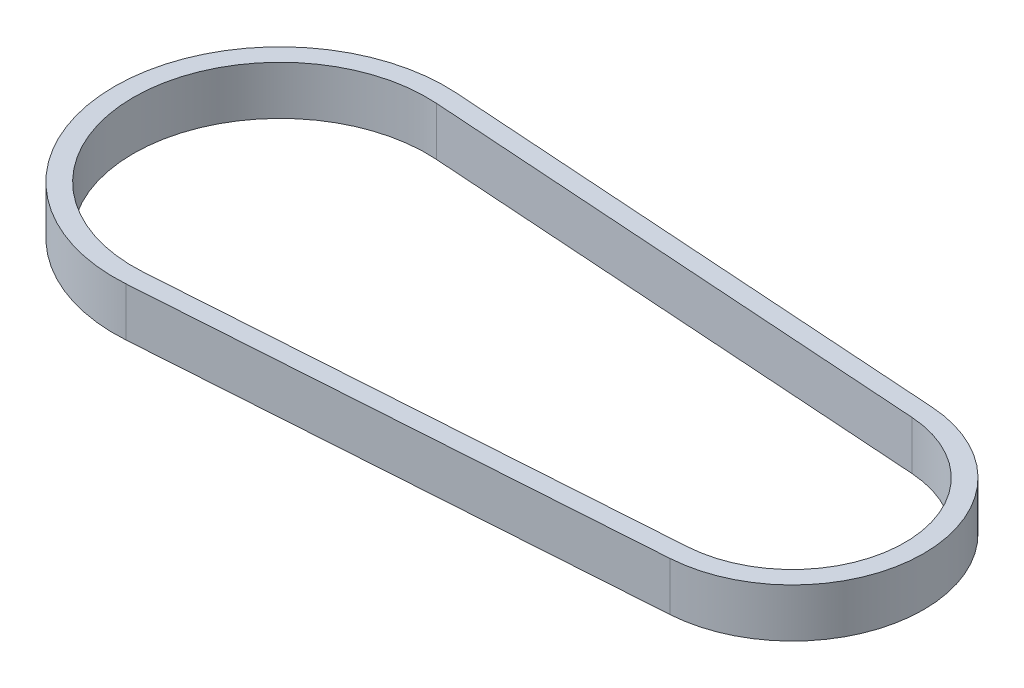
ISO-10303-21;
HEADER;
FILE_DESCRIPTION(('STEP AP214'),'2;1');
FILE_NAME('part.step','',(''),(''),'','','');
FILE_SCHEMA(('AUTOMOTIVE_DESIGN { 1 0 10303 214 1 1 1 1 }'));
ENDSEC;
DATA;
#1=APPLICATION_CONTEXT('core data for automotive mechanical design processes');
#2=APPLICATION_PROTOCOL_DEFINITION('international standard','automotive_design',2000,#1);
#3=PRODUCT_CONTEXT('',#1,'mechanical');
#4=PRODUCT('Part','Part','',(#3));
#5=PRODUCT_RELATED_PRODUCT_CATEGORY('part','',(#4));
#6=PRODUCT_DEFINITION_FORMATION('','',#4);
#7=PRODUCT_DEFINITION_CONTEXT('part definition',#1,'design');
#8=PRODUCT_DEFINITION('design','',#6,#7);
#9=PRODUCT_DEFINITION_SHAPE('','',#8);
#10=(LENGTH_UNIT() NAMED_UNIT(*) SI_UNIT(.MILLI.,.METRE.));
#11=(NAMED_UNIT(*) PLANE_ANGLE_UNIT() SI_UNIT($,.RADIAN.));
#12=(NAMED_UNIT(*) SI_UNIT($,.STERADIAN.) SOLID_ANGLE_UNIT());
#13=UNCERTAINTY_MEASURE_WITH_UNIT(LENGTH_MEASURE(1.E-05),#10,'distance_accuracy_value','');
#14=(GEOMETRIC_REPRESENTATION_CONTEXT(3) GLOBAL_UNCERTAINTY_ASSIGNED_CONTEXT((#13)) GLOBAL_UNIT_ASSIGNED_CONTEXT((#10,
#11,#12)) REPRESENTATION_CONTEXT('',''));
#15=CARTESIAN_POINT('',(0.,0.,0.));
#16=DIRECTION('',(0.,0.,1.));
#17=DIRECTION('',(1.,0.,0.));
#18=AXIS2_PLACEMENT_3D('',#15,#16,#17);
#19=CARTESIAN_POINT('',(2.05303270042194,9.,-30.5811634299776));
#20=DIRECTION('',(0.0669831223628692,0.,-0.997754108645272));
#21=DIRECTION('',(-0.997754108645272,0.,-0.0669831223628692));
#22=AXIS2_PLACEMENT_3D('',#19,#20,#21);
#23=PLANE('',#22);
#24=DIRECTION('',(0.997754108645272,0.,0.0669831223628692));
#25=VECTOR('',#24,1.);
#26=CARTESIAN_POINT('',(2.05303270042194,0.,-30.5811634299776));
#27=LINE('',#26,#25);
#28=CARTESIAN_POINT('',(2.05303270042194,0.,-30.5811634299776));
#29=VERTEX_POINT('',#28);
#30=CARTESIAN_POINT('',(96.4276898734177,0.,-24.2454248400801));
#31=VERTEX_POINT('',#30);
#32=EDGE_CURVE('E155',#29,#31,#27,.T.);
#33=ORIENTED_EDGE('',*,*,#32,.F.);
#34=DIRECTION('',(0.,-1.,0.));
#35=VECTOR('',#34,1.);
#36=CARTESIAN_POINT('',(2.05303270042194,9.,-30.5811634299776));
#37=LINE('',#36,#35);
#38=CARTESIAN_POINT('',(2.05303270042194,9.,-30.5811634299776));
#39=VERTEX_POINT('',#38);
#40=EDGE_CURVE('E11',#39,#29,#37,.T.);
#41=ORIENTED_EDGE('',*,*,#40,.F.);
#42=DIRECTION('',(0.997754108645272,0.,0.0669831223628692));
#43=VECTOR('',#42,1.);
#44=CARTESIAN_POINT('',(2.05303270042194,9.,-30.5811634299776));
#45=LINE('',#44,#43);
#46=CARTESIAN_POINT('',(96.4276898734177,9.,-24.2454248400801));
#47=VERTEX_POINT('',#46);
#48=EDGE_CURVE('E128',#39,#47,#45,.T.);
#49=ORIENTED_EDGE('',*,*,#48,.T.);
#50=DIRECTION('',(0.,-1.,0.));
#51=VECTOR('',#50,1.);
#52=CARTESIAN_POINT('',(96.4276898734177,9.,-24.2454248400801));
#53=LINE('',#52,#51);
#54=EDGE_CURVE('E94',#47,#31,#53,.T.);
#55=ORIENTED_EDGE('',*,*,#54,.T.);
#56=EDGE_LOOP('',(#33,#41,#49,#55));
#57=FACE_BOUND('',#56,.T.);
#58=ADVANCED_FACE('F41',(#57),#23,.T.);
#59=CARTESIAN_POINT('',(0.,9.,0.));
#60=DIRECTION('',(0.,-1.,0.));
#61=DIRECTION('',(0.,0.,-1.));
#62=AXIS2_PLACEMENT_3D('',#59,#60,#61);
#63=CYLINDRICAL_SURFACE('',#62,30.65);
#64=CARTESIAN_POINT('',(0.,0.,0.));
#65=DIRECTION('',(0.,1.,0.));
#66=DIRECTION('',(0.,0.,1.));
#67=AXIS2_PLACEMENT_3D('',#64,#65,#66);
#68=CIRCLE('',#67,30.65);
#69=CARTESIAN_POINT('',(2.05303270042194,0.,30.5811634299776));
#70=VERTEX_POINT('',#69);
#71=EDGE_CURVE('E133',#29,#70,#68,.T.);
#72=ORIENTED_EDGE('',*,*,#71,.T.);
#73=DIRECTION('',(0.,-1.,0.));
#74=VECTOR('',#73,1.);
#75=CARTESIAN_POINT('',(2.05303270042194,9.,30.5811634299776));
#76=LINE('',#75,#74);
#77=CARTESIAN_POINT('',(2.05303270042194,9.,30.5811634299776));
#78=VERTEX_POINT('',#77);
#79=EDGE_CURVE('E51',#78,#70,#76,.T.);
#80=ORIENTED_EDGE('',*,*,#79,.F.);
#81=CARTESIAN_POINT('',(0.,9.,0.));
#82=DIRECTION('',(0.,1.,0.));
#83=DIRECTION('',(0.,0.,1.));
#84=AXIS2_PLACEMENT_3D('',#81,#82,#83);
#85=CIRCLE('',#84,30.65);
#86=EDGE_CURVE('E124',#39,#78,#85,.T.);
#87=ORIENTED_EDGE('',*,*,#86,.F.);
#88=ORIENTED_EDGE('',*,*,#40,.T.);
#89=EDGE_LOOP('',(#72,#80,#87,#88));
#90=FACE_BOUND('',#89,.T.);
#91=ADVANCED_FACE('F131',(#90),#63,.T.);
#92=CARTESIAN_POINT('',(2.05303270042194,9.,30.5811634299776));
#93=DIRECTION('',(-0.0669831223628691,0.,-0.997754108645272));
#94=DIRECTION('',(-0.997754108645272,0.,0.0669831223628691));
#95=AXIS2_PLACEMENT_3D('',#92,#93,#94);
#96=PLANE('',#95);
#97=DIRECTION('',(0.997754108645272,0.,-0.0669831223628691));
#98=VECTOR('',#97,1.);
#99=CARTESIAN_POINT('',(2.05303270042194,0.,30.5811634299776));
#100=LINE('',#99,#98);
#101=CARTESIAN_POINT('',(96.4276898734177,0.,24.2454248400801));
#102=VERTEX_POINT('',#101);
#103=EDGE_CURVE('E152',#70,#102,#100,.T.);
#104=ORIENTED_EDGE('',*,*,#103,.T.);
#105=DIRECTION('',(0.,-1.,0.));
#106=VECTOR('',#105,1.);
#107=CARTESIAN_POINT('',(96.4276898734177,9.,24.2454248400801));
#108=LINE('',#107,#106);
#109=CARTESIAN_POINT('',(96.4276898734177,9.,24.2454248400801));
#110=VERTEX_POINT('',#109);
#111=EDGE_CURVE('E123',#110,#102,#108,.T.);
#112=ORIENTED_EDGE('',*,*,#111,.F.);
#113=DIRECTION('',(0.997754108645272,0.,-0.0669831223628691));
#114=VECTOR('',#113,1.);
#115=CARTESIAN_POINT('',(2.05303270042194,9.,30.5811634299776));
#116=LINE('',#115,#114);
#117=EDGE_CURVE('E117',#78,#110,#116,.T.);
#118=ORIENTED_EDGE('',*,*,#117,.F.);
#119=ORIENTED_EDGE('',*,*,#79,.T.);
#120=EDGE_LOOP('',(#104,#112,#118,#119));
#121=FACE_BOUND('',#120,.T.);
#122=ADVANCED_FACE('F120',(#121),#96,.F.);
#123=CARTESIAN_POINT('',(0.,9.,0.));
#124=DIRECTION('',(0.,-1.,0.));
#125=DIRECTION('',(0.,0.,-1.));
#126=AXIS2_PLACEMENT_3D('',#123,#124,#125);
#127=CYLINDRICAL_SURFACE('',#126,27.15);
#128=CARTESIAN_POINT('',(0.,0.,0.));
#129=DIRECTION('',(0.,1.,0.));
#130=DIRECTION('',(0.,0.,1.));
#131=AXIS2_PLACEMENT_3D('',#128,#129,#130);
#132=CIRCLE('',#131,27.15);
#133=CARTESIAN_POINT('',(1.8185917721519,0.,-27.0890240497191));
#134=VERTEX_POINT('',#133);
#135=CARTESIAN_POINT('',(1.8185917721519,0.,27.0890240497191));
#136=VERTEX_POINT('',#135);
#137=EDGE_CURVE('E165',#134,#136,#132,.T.);
#138=ORIENTED_EDGE('',*,*,#137,.F.);
#139=DIRECTION('',(0.,-1.,0.));
#140=VECTOR('',#139,1.);
#141=CARTESIAN_POINT('',(1.8185917721519,9.,-27.0890240497191));
#142=LINE('',#141,#140);
#143=CARTESIAN_POINT('',(1.8185917721519,9.,-27.0890240497191));
#144=VERTEX_POINT('',#143);
#145=EDGE_CURVE('E45',#144,#134,#142,.T.);
#146=ORIENTED_EDGE('',*,*,#145,.F.);
#147=CARTESIAN_POINT('',(0.,9.,0.));
#148=DIRECTION('',(0.,1.,0.));
#149=DIRECTION('',(0.,0.,1.));
#150=AXIS2_PLACEMENT_3D('',#147,#148,#149);
#151=CIRCLE('',#150,27.15);
#152=CARTESIAN_POINT('',(1.8185917721519,9.,27.0890240497191));
#153=VERTEX_POINT('',#152);
#154=EDGE_CURVE('E151',#144,#153,#151,.T.);
#155=ORIENTED_EDGE('',*,*,#154,.T.);
#156=DIRECTION('',(0.,-1.,0.));
#157=VECTOR('',#156,1.);
#158=CARTESIAN_POINT('',(1.8185917721519,9.,27.0890240497191));
#159=LINE('',#158,#157);
#160=EDGE_CURVE('E138',#153,#136,#159,.T.);
#161=ORIENTED_EDGE('',*,*,#160,.T.);
#162=EDGE_LOOP('',(#138,#146,#155,#161));
#163=FACE_BOUND('',#162,.T.);
#164=ADVANCED_FACE('F43',(#163),#127,.F.);
#165=CARTESIAN_POINT('',(1.8185917721519,9.,-27.0890240497191));
#166=DIRECTION('',(0.0669831223628692,0.,-0.997754108645272));
#167=DIRECTION('',(-0.997754108645272,0.,-0.0669831223628692));
#168=AXIS2_PLACEMENT_3D('',#165,#166,#167);
#169=PLANE('',#168);
#170=DIRECTION('',(0.997754108645272,0.,0.0669831223628692));
#171=VECTOR('',#170,1.);
#172=CARTESIAN_POINT('',(1.8185917721519,0.,-27.0890240497191));
#173=LINE('',#172,#171);
#174=CARTESIAN_POINT('',(96.1932489451477,0.,-20.7532854598216));
#175=VERTEX_POINT('',#174);
#176=EDGE_CURVE('E163',#134,#175,#173,.T.);
#177=ORIENTED_EDGE('',*,*,#176,.T.);
#178=DIRECTION('',(0.,-1.,0.));
#179=VECTOR('',#178,1.);
#180=CARTESIAN_POINT('',(96.1932489451477,9.,-20.7532854598216));
#181=LINE('',#180,#179);
#182=CARTESIAN_POINT('',(96.1932489451477,9.,-20.7532854598216));
#183=VERTEX_POINT('',#182);
#184=EDGE_CURVE('E141',#183,#175,#181,.T.);
#185=ORIENTED_EDGE('',*,*,#184,.F.);
#186=DIRECTION('',(0.997754108645272,0.,0.0669831223628692));
#187=VECTOR('',#186,1.);
#188=CARTESIAN_POINT('',(1.8185917721519,9.,-27.0890240497191));
#189=LINE('',#188,#187);
#190=EDGE_CURVE('E175',#144,#183,#189,.T.);
#191=ORIENTED_EDGE('',*,*,#190,.F.);
#192=ORIENTED_EDGE('',*,*,#145,.T.);
#193=EDGE_LOOP('',(#177,#185,#191,#192));
#194=FACE_BOUND('',#193,.T.);
#195=ADVANCED_FACE('F186',(#194),#169,.F.);
#196=CARTESIAN_POINT('',(94.8,9.,0.));
#197=DIRECTION('',(0.,-1.,0.));
#198=DIRECTION('',(0.,0.,-1.));
#199=AXIS2_PLACEMENT_3D('',#196,#197,#198);
#200=CYLINDRICAL_SURFACE('',#199,20.8);
#201=CARTESIAN_POINT('',(94.8,0.,0.));
#202=DIRECTION('',(0.,1.,0.));
#203=DIRECTION('',(0.,0.,1.));
#204=AXIS2_PLACEMENT_3D('',#201,#202,#203);
#205=CIRCLE('',#204,20.8);
#206=CARTESIAN_POINT('',(96.1932489451477,0.,20.7532854598217));
#207=VERTEX_POINT('',#206);
#208=EDGE_CURVE('E160',#207,#175,#205,.T.);
#209=ORIENTED_EDGE('',*,*,#208,.F.);
#210=DIRECTION('',(0.,-1.,0.));
#211=VECTOR('',#210,1.);
#212=CARTESIAN_POINT('',(96.1932489451477,9.,20.7532854598217));
#213=LINE('',#212,#211);
#214=CARTESIAN_POINT('',(96.1932489451477,9.,20.7532854598217));
#215=VERTEX_POINT('',#214);
#216=EDGE_CURVE('E140',#215,#207,#213,.T.);
#217=ORIENTED_EDGE('',*,*,#216,.F.);
#218=CARTESIAN_POINT('',(94.8,9.,0.));
#219=DIRECTION('',(0.,1.,0.));
#220=DIRECTION('',(0.,0.,1.));
#221=AXIS2_PLACEMENT_3D('',#218,#219,#220);
#222=CIRCLE('',#221,20.8);
#223=EDGE_CURVE('E173',#215,#183,#222,.T.);
#224=ORIENTED_EDGE('',*,*,#223,.T.);
#225=ORIENTED_EDGE('',*,*,#184,.T.);
#226=EDGE_LOOP('',(#209,#217,#224,#225));
#227=FACE_BOUND('',#226,.T.);
#228=ADVANCED_FACE('F187',(#227),#200,.F.);
#229=CARTESIAN_POINT('',(1.8185917721519,9.,27.0890240497191));
#230=DIRECTION('',(-0.0669831223628691,0.,-0.997754108645272));
#231=DIRECTION('',(-0.997754108645272,0.,0.0669831223628691));
#232=AXIS2_PLACEMENT_3D('',#229,#230,#231);
#233=PLANE('',#232);
#234=DIRECTION('',(0.997754108645272,0.,-0.0669831223628691));
#235=VECTOR('',#234,1.);
#236=CARTESIAN_POINT('',(1.8185917721519,0.,27.0890240497191));
#237=LINE('',#236,#235);
#238=EDGE_CURVE('E157',#136,#207,#237,.T.);
#239=ORIENTED_EDGE('',*,*,#238,.F.);
#240=ORIENTED_EDGE('',*,*,#160,.F.);
#241=DIRECTION('',(0.997754108645272,0.,-0.0669831223628691));
#242=VECTOR('',#241,1.);
#243=CARTESIAN_POINT('',(1.8185917721519,9.,27.0890240497191));
#244=LINE('',#243,#242);
#245=EDGE_CURVE('E170',#153,#215,#244,.T.);
#246=ORIENTED_EDGE('',*,*,#245,.T.);
#247=ORIENTED_EDGE('',*,*,#216,.T.);
#248=EDGE_LOOP('',(#239,#240,#246,#247));
#249=FACE_BOUND('',#248,.T.);
#250=ADVANCED_FACE('F183',(#249),#233,.T.);
#251=CARTESIAN_POINT('',(94.8,9.,0.));
#252=DIRECTION('',(0.,-1.,0.));
#253=DIRECTION('',(0.,0.,-1.));
#254=AXIS2_PLACEMENT_3D('',#251,#252,#253);
#255=CYLINDRICAL_SURFACE('',#254,24.3);
#256=CARTESIAN_POINT('',(94.8,0.,0.));
#257=DIRECTION('',(0.,1.,0.));
#258=DIRECTION('',(0.,0.,1.));
#259=AXIS2_PLACEMENT_3D('',#256,#257,#258);
#260=CIRCLE('',#259,24.3);
#261=EDGE_CURVE('E87',#102,#31,#260,.T.);
#262=ORIENTED_EDGE('',*,*,#261,.T.);
#263=ORIENTED_EDGE('',*,*,#54,.F.);
#264=CARTESIAN_POINT('',(94.8,9.,0.));
#265=DIRECTION('',(0.,1.,0.));
#266=DIRECTION('',(0.,0.,1.));
#267=AXIS2_PLACEMENT_3D('',#264,#265,#266);
#268=CIRCLE('',#267,24.3);
#269=EDGE_CURVE('E60',#110,#47,#268,.T.);
#270=ORIENTED_EDGE('',*,*,#269,.F.);
#271=ORIENTED_EDGE('',*,*,#111,.T.);
#272=EDGE_LOOP('',(#262,#263,#270,#271));
#273=FACE_BOUND('',#272,.T.);
#274=ADVANCED_FACE('F194',(#273),#255,.T.);
#275=CARTESIAN_POINT('',(0.,9.,0.));
#276=DIRECTION('',(0.,1.,0.));
#277=DIRECTION('',(0.,0.,1.));
#278=AXIS2_PLACEMENT_3D('',#275,#276,#277);
#279=PLANE('',#278);
#280=ORIENTED_EDGE('',*,*,#154,.F.);
#281=ORIENTED_EDGE('',*,*,#190,.T.);
#282=ORIENTED_EDGE('',*,*,#223,.F.);
#283=ORIENTED_EDGE('',*,*,#245,.F.);
#284=EDGE_LOOP('',(#280,#281,#282,#283));
#285=FACE_BOUND('',#284,.T.);
#286=ORIENTED_EDGE('',*,*,#48,.F.);
#287=ORIENTED_EDGE('',*,*,#86,.T.);
#288=ORIENTED_EDGE('',*,*,#117,.T.);
#289=ORIENTED_EDGE('',*,*,#269,.T.);
#290=EDGE_LOOP('',(#286,#287,#288,#289));
#291=FACE_BOUND('',#290,.T.);
#292=ADVANCED_FACE('F127',(#285,#291),#279,.T.);
#293=CARTESIAN_POINT('',(0.,0.,0.));
#294=DIRECTION('',(0.,1.,0.));
#295=DIRECTION('',(0.,0.,1.));
#296=AXIS2_PLACEMENT_3D('',#293,#294,#295);
#297=PLANE('',#296);
#298=ORIENTED_EDGE('',*,*,#137,.T.);
#299=ORIENTED_EDGE('',*,*,#238,.T.);
#300=ORIENTED_EDGE('',*,*,#208,.T.);
#301=ORIENTED_EDGE('',*,*,#176,.F.);
#302=EDGE_LOOP('',(#298,#299,#300,#301));
#303=FACE_BOUND('',#302,.T.);
#304=ORIENTED_EDGE('',*,*,#32,.T.);
#305=ORIENTED_EDGE('',*,*,#261,.F.);
#306=ORIENTED_EDGE('',*,*,#103,.F.);
#307=ORIENTED_EDGE('',*,*,#71,.F.);
#308=EDGE_LOOP('',(#304,#305,#306,#307));
#309=FACE_BOUND('',#308,.T.);
#310=ADVANCED_FACE('F185',(#303,#309),#297,.F.);
#311=CLOSED_SHELL('',(#58,#91,#122,#164,#195,#228,#250,#274,#292,#310));
#312=MANIFOLD_SOLID_BREP('B2',#311);
#313=ADVANCED_BREP_SHAPE_REPRESENTATION('',(#18,#312),#14);
#314=SHAPE_DEFINITION_REPRESENTATION(#9,#313);
ENDSEC;
END-ISO-10303-21;
